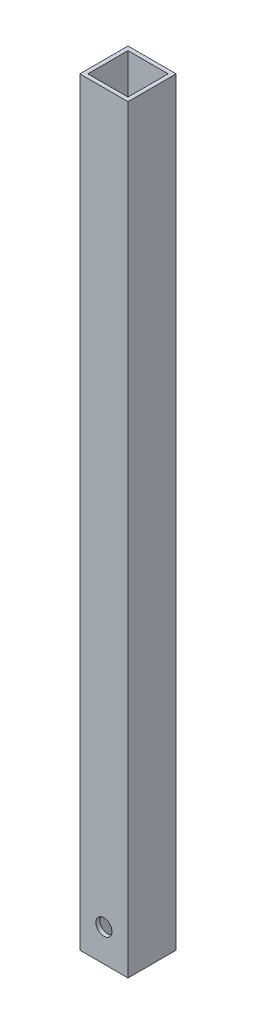
ISO-10303-21;
HEADER;
FILE_DESCRIPTION(('STEP AP214'),'2;1');
FILE_NAME('part.step','',(''),(''),'','','');
FILE_SCHEMA(('AUTOMOTIVE_DESIGN { 1 0 10303 214 1 1 1 1 }'));
ENDSEC;
DATA;
#1=APPLICATION_CONTEXT('core data for automotive mechanical design processes');
#2=APPLICATION_PROTOCOL_DEFINITION('international standard','automotive_design',2000,#1);
#3=PRODUCT_CONTEXT('',#1,'mechanical');
#4=PRODUCT('Part','Part','',(#3));
#5=PRODUCT_RELATED_PRODUCT_CATEGORY('part','',(#4));
#6=PRODUCT_DEFINITION_FORMATION('','',#4);
#7=PRODUCT_DEFINITION_CONTEXT('part definition',#1,'design');
#8=PRODUCT_DEFINITION('design','',#6,#7);
#9=PRODUCT_DEFINITION_SHAPE('','',#8);
#10=(LENGTH_UNIT() NAMED_UNIT(*) SI_UNIT(.MILLI.,.METRE.));
#11=(NAMED_UNIT(*) PLANE_ANGLE_UNIT() SI_UNIT($,.RADIAN.));
#12=(NAMED_UNIT(*) SI_UNIT($,.STERADIAN.) SOLID_ANGLE_UNIT());
#13=UNCERTAINTY_MEASURE_WITH_UNIT(LENGTH_MEASURE(1.E-05),#10,'distance_accuracy_value','');
#14=(GEOMETRIC_REPRESENTATION_CONTEXT(3) GLOBAL_UNCERTAINTY_ASSIGNED_CONTEXT((#13)) GLOBAL_UNIT_ASSIGNED_CONTEXT((#10,
#11,#12)) REPRESENTATION_CONTEXT('',''));
#15=CARTESIAN_POINT('',(0.,0.,0.));
#16=DIRECTION('',(0.,0.,1.));
#17=DIRECTION('',(1.,0.,0.));
#18=AXIS2_PLACEMENT_3D('',#15,#16,#17);
#19=CARTESIAN_POINT('',(0.,300.,0.));
#20=DIRECTION('',(0.,-1.,0.));
#21=DIRECTION('',(0.,0.,-1.));
#22=AXIS2_PLACEMENT_3D('',#19,#20,#21);
#23=PLANE('',#22);
#24=DIRECTION('',(0.,0.,-1.));
#25=VECTOR('',#24,1.);
#26=CARTESIAN_POINT('',(9.525,300.,9.525));
#27=LINE('',#26,#25);
#28=CARTESIAN_POINT('',(9.525,300.,9.525));
#29=VERTEX_POINT('',#28);
#30=CARTESIAN_POINT('',(9.525,300.,-9.525));
#31=VERTEX_POINT('',#30);
#32=EDGE_CURVE('E137',#29,#31,#27,.T.);
#33=ORIENTED_EDGE('',*,*,#32,.T.);
#34=DIRECTION('',(-1.,0.,0.));
#35=VECTOR('',#34,1.);
#36=CARTESIAN_POINT('',(-9.525,300.,-9.525));
#37=LINE('',#36,#35);
#38=CARTESIAN_POINT('',(-9.525,300.,-9.525));
#39=VERTEX_POINT('',#38);
#40=EDGE_CURVE('E140',#31,#39,#37,.T.);
#41=ORIENTED_EDGE('',*,*,#40,.T.);
#42=DIRECTION('',(0.,0.,1.));
#43=VECTOR('',#42,1.);
#44=CARTESIAN_POINT('',(-9.525,300.,9.525));
#45=LINE('',#44,#43);
#46=CARTESIAN_POINT('',(-9.525,300.,9.525));
#47=VERTEX_POINT('',#46);
#48=EDGE_CURVE('E143',#39,#47,#45,.T.);
#49=ORIENTED_EDGE('',*,*,#48,.T.);
#50=DIRECTION('',(1.,0.,0.));
#51=VECTOR('',#50,1.);
#52=CARTESIAN_POINT('',(-9.525,300.,9.525));
#53=LINE('',#52,#51);
#54=EDGE_CURVE('E145',#47,#29,#53,.T.);
#55=ORIENTED_EDGE('',*,*,#54,.T.);
#56=EDGE_LOOP('',(#33,#41,#49,#55));
#57=FACE_BOUND('',#56,.T.);
#58=DIRECTION('',(0.,0.,-1.));
#59=VECTOR('',#58,1.);
#60=CARTESIAN_POINT('',(7.93750000000001,300.,7.93749999999995));
#61=LINE('',#60,#59);
#62=CARTESIAN_POINT('',(7.93750000000001,300.,7.93749999999995));
#63=VERTEX_POINT('',#62);
#64=CARTESIAN_POINT('',(7.9375,300.,-7.93749999999999));
#65=VERTEX_POINT('',#64);
#66=EDGE_CURVE('E99',#63,#65,#61,.T.);
#67=ORIENTED_EDGE('',*,*,#66,.F.);
#68=DIRECTION('',(1.,0.,0.));
#69=VECTOR('',#68,1.);
#70=CARTESIAN_POINT('',(-7.93749999999997,300.,7.93749999999995));
#71=LINE('',#70,#69);
#72=CARTESIAN_POINT('',(-7.93749999999997,300.,7.93749999999995));
#73=VERTEX_POINT('',#72);
#74=EDGE_CURVE('E121',#73,#63,#71,.T.);
#75=ORIENTED_EDGE('',*,*,#74,.F.);
#76=DIRECTION('',(0.,0.,1.));
#77=VECTOR('',#76,1.);
#78=CARTESIAN_POINT('',(-7.93749999999997,300.,7.93749999999995));
#79=LINE('',#78,#77);
#80=CARTESIAN_POINT('',(-7.93749999999997,300.,-7.93749999999999));
#81=VERTEX_POINT('',#80);
#82=EDGE_CURVE('E119',#81,#73,#79,.T.);
#83=ORIENTED_EDGE('',*,*,#82,.F.);
#84=DIRECTION('',(-1.,0.,0.));
#85=VECTOR('',#84,1.);
#86=CARTESIAN_POINT('',(-7.93749999999997,300.,-7.93749999999999));
#87=LINE('',#86,#85);
#88=EDGE_CURVE('E107',#65,#81,#87,.T.);
#89=ORIENTED_EDGE('',*,*,#88,.F.);
#90=EDGE_LOOP('',(#67,#75,#83,#89));
#91=FACE_BOUND('',#90,.T.);
#92=ADVANCED_FACE('F33',(#57,#91),#23,.F.);
#93=CARTESIAN_POINT('',(0.,0.,0.));
#94=DIRECTION('',(0.,-1.,0.));
#95=DIRECTION('',(0.,0.,-1.));
#96=AXIS2_PLACEMENT_3D('',#93,#94,#95);
#97=PLANE('',#96);
#98=DIRECTION('',(0.,0.,-1.));
#99=VECTOR('',#98,1.);
#100=CARTESIAN_POINT('',(9.525,0.,9.525));
#101=LINE('',#100,#99);
#102=CARTESIAN_POINT('',(9.525,0.,9.525));
#103=VERTEX_POINT('',#102);
#104=CARTESIAN_POINT('',(9.525,0.,-9.525));
#105=VERTEX_POINT('',#104);
#106=EDGE_CURVE('E115',#103,#105,#101,.T.);
#107=ORIENTED_EDGE('',*,*,#106,.F.);
#108=DIRECTION('',(1.,0.,0.));
#109=VECTOR('',#108,1.);
#110=CARTESIAN_POINT('',(-9.525,0.,9.525));
#111=LINE('',#110,#109);
#112=CARTESIAN_POINT('',(-9.525,0.,9.525));
#113=VERTEX_POINT('',#112);
#114=EDGE_CURVE('E141',#113,#103,#111,.T.);
#115=ORIENTED_EDGE('',*,*,#114,.F.);
#116=DIRECTION('',(0.,0.,1.));
#117=VECTOR('',#116,1.);
#118=CARTESIAN_POINT('',(-9.525,0.,9.525));
#119=LINE('',#118,#117);
#120=CARTESIAN_POINT('',(-9.525,0.,-9.525));
#121=VERTEX_POINT('',#120);
#122=EDGE_CURVE('E152',#121,#113,#119,.T.);
#123=ORIENTED_EDGE('',*,*,#122,.F.);
#124=DIRECTION('',(-1.,0.,0.));
#125=VECTOR('',#124,1.);
#126=CARTESIAN_POINT('',(-9.525,0.,-9.525));
#127=LINE('',#126,#125);
#128=EDGE_CURVE('E150',#105,#121,#127,.T.);
#129=ORIENTED_EDGE('',*,*,#128,.F.);
#130=EDGE_LOOP('',(#107,#115,#123,#129));
#131=FACE_BOUND('',#130,.T.);
#132=DIRECTION('',(1.,0.,0.));
#133=VECTOR('',#132,1.);
#134=CARTESIAN_POINT('',(-7.93749999999997,0.,7.93749999999995));
#135=LINE('',#134,#133);
#136=CARTESIAN_POINT('',(-7.93749999999997,0.,7.93749999999995));
#137=VERTEX_POINT('',#136);
#138=CARTESIAN_POINT('',(7.93750000000001,0.,7.93749999999995));
#139=VERTEX_POINT('',#138);
#140=EDGE_CURVE('E108',#137,#139,#135,.T.);
#141=ORIENTED_EDGE('',*,*,#140,.T.);
#142=DIRECTION('',(0.,0.,-1.));
#143=VECTOR('',#142,1.);
#144=CARTESIAN_POINT('',(7.93750000000001,0.,7.93749999999995));
#145=LINE('',#144,#143);
#146=CARTESIAN_POINT('',(7.9375,0.,-7.93749999999999));
#147=VERTEX_POINT('',#146);
#148=EDGE_CURVE('E57',#139,#147,#145,.T.);
#149=ORIENTED_EDGE('',*,*,#148,.T.);
#150=DIRECTION('',(-1.,0.,0.));
#151=VECTOR('',#150,1.);
#152=CARTESIAN_POINT('',(-7.93749999999997,0.,-7.93749999999999));
#153=LINE('',#152,#151);
#154=CARTESIAN_POINT('',(-7.93749999999997,0.,-7.93749999999999));
#155=VERTEX_POINT('',#154);
#156=EDGE_CURVE('E114',#147,#155,#153,.T.);
#157=ORIENTED_EDGE('',*,*,#156,.T.);
#158=DIRECTION('',(0.,0.,1.));
#159=VECTOR('',#158,1.);
#160=CARTESIAN_POINT('',(-7.93749999999997,0.,7.93749999999995));
#161=LINE('',#160,#159);
#162=EDGE_CURVE('E129',#155,#137,#161,.T.);
#163=ORIENTED_EDGE('',*,*,#162,.T.);
#164=EDGE_LOOP('',(#141,#149,#157,#163));
#165=FACE_BOUND('',#164,.T.);
#166=ADVANCED_FACE('F171',(#131,#165),#97,.T.);
#167=CARTESIAN_POINT('',(9.525,300.,9.525));
#168=DIRECTION('',(-1.,0.,0.));
#169=DIRECTION('',(0.,0.,1.));
#170=AXIS2_PLACEMENT_3D('',#167,#168,#169);
#171=PLANE('',#170);
#172=ORIENTED_EDGE('',*,*,#106,.T.);
#173=DIRECTION('',(0.,-1.,0.));
#174=VECTOR('',#173,1.);
#175=CARTESIAN_POINT('',(9.525,300.,-9.525));
#176=LINE('',#175,#174);
#177=EDGE_CURVE('E11',#31,#105,#176,.T.);
#178=ORIENTED_EDGE('',*,*,#177,.F.);
#179=ORIENTED_EDGE('',*,*,#32,.F.);
#180=DIRECTION('',(0.,-1.,0.));
#181=VECTOR('',#180,1.);
#182=CARTESIAN_POINT('',(9.525,300.,9.525));
#183=LINE('',#182,#181);
#184=EDGE_CURVE('E147',#29,#103,#183,.T.);
#185=ORIENTED_EDGE('',*,*,#184,.T.);
#186=EDGE_LOOP('',(#172,#178,#179,#185));
#187=FACE_BOUND('',#186,.T.);
#188=ADVANCED_FACE('F35',(#187),#171,.F.);
#189=CARTESIAN_POINT('',(-9.525,300.,-9.525));
#190=DIRECTION('',(0.,0.,1.));
#191=DIRECTION('',(1.,0.,0.));
#192=AXIS2_PLACEMENT_3D('',#189,#190,#191);
#193=PLANE('',#192);
#194=CARTESIAN_POINT('',(0.,12.7,-9.525));
#195=DIRECTION('',(0.,0.,1.));
#196=DIRECTION('',(1.,0.,0.));
#197=AXIS2_PLACEMENT_3D('',#194,#195,#196);
#198=CIRCLE('',#197,3.175);
#199=CARTESIAN_POINT('',(3.175,12.7,-9.525));
#200=VERTEX_POINT('',#199);
#201=EDGE_CURVE('E208',#200,#200,#198,.T.);
#202=ORIENTED_EDGE('',*,*,#201,.T.);
#203=EDGE_LOOP('',(#202));
#204=FACE_BOUND('',#203,.T.);
#205=ORIENTED_EDGE('',*,*,#128,.T.);
#206=DIRECTION('',(0.,-1.,0.));
#207=VECTOR('',#206,1.);
#208=CARTESIAN_POINT('',(-9.525,300.,-9.525));
#209=LINE('',#208,#207);
#210=EDGE_CURVE('E42',#39,#121,#209,.T.);
#211=ORIENTED_EDGE('',*,*,#210,.F.);
#212=ORIENTED_EDGE('',*,*,#40,.F.);
#213=ORIENTED_EDGE('',*,*,#177,.T.);
#214=EDGE_LOOP('',(#205,#211,#212,#213));
#215=FACE_BOUND('',#214,.T.);
#216=ADVANCED_FACE('F181',(#204,#215),#193,.F.);
#217=CARTESIAN_POINT('',(-9.525,300.,9.525));
#218=DIRECTION('',(1.,0.,0.));
#219=DIRECTION('',(0.,0.,-1.));
#220=AXIS2_PLACEMENT_3D('',#217,#218,#219);
#221=PLANE('',#220);
#222=ORIENTED_EDGE('',*,*,#122,.T.);
#223=DIRECTION('',(0.,-1.,0.));
#224=VECTOR('',#223,1.);
#225=CARTESIAN_POINT('',(-9.525,300.,9.525));
#226=LINE('',#225,#224);
#227=EDGE_CURVE('E157',#47,#113,#226,.T.);
#228=ORIENTED_EDGE('',*,*,#227,.F.);
#229=ORIENTED_EDGE('',*,*,#48,.F.);
#230=ORIENTED_EDGE('',*,*,#210,.T.);
#231=EDGE_LOOP('',(#222,#228,#229,#230));
#232=FACE_BOUND('',#231,.T.);
#233=ADVANCED_FACE('F165',(#232),#221,.F.);
#234=CARTESIAN_POINT('',(-9.525,300.,9.525));
#235=DIRECTION('',(0.,0.,-1.));
#236=DIRECTION('',(-1.,0.,0.));
#237=AXIS2_PLACEMENT_3D('',#234,#235,#236);
#238=PLANE('',#237);
#239=CARTESIAN_POINT('',(0.,12.7,9.525));
#240=DIRECTION('',(0.,0.,1.));
#241=DIRECTION('',(1.,0.,0.));
#242=AXIS2_PLACEMENT_3D('',#239,#240,#241);
#243=CIRCLE('',#242,3.175);
#244=CARTESIAN_POINT('',(3.175,12.7,9.525));
#245=VERTEX_POINT('',#244);
#246=EDGE_CURVE('E206',#245,#245,#243,.T.);
#247=ORIENTED_EDGE('',*,*,#246,.F.);
#248=EDGE_LOOP('',(#247));
#249=FACE_BOUND('',#248,.T.);
#250=ORIENTED_EDGE('',*,*,#114,.T.);
#251=ORIENTED_EDGE('',*,*,#184,.F.);
#252=ORIENTED_EDGE('',*,*,#54,.F.);
#253=ORIENTED_EDGE('',*,*,#227,.T.);
#254=EDGE_LOOP('',(#250,#251,#252,#253));
#255=FACE_BOUND('',#254,.T.);
#256=ADVANCED_FACE('F175',(#249,#255),#238,.F.);
#257=CARTESIAN_POINT('',(7.93750000000001,300.,7.93749999999995));
#258=DIRECTION('',(-1.,0.,0.));
#259=DIRECTION('',(0.,0.,1.));
#260=AXIS2_PLACEMENT_3D('',#257,#258,#259);
#261=PLANE('',#260);
#262=ORIENTED_EDGE('',*,*,#148,.F.);
#263=DIRECTION('',(0.,-1.,0.));
#264=VECTOR('',#263,1.);
#265=CARTESIAN_POINT('',(7.93750000000001,300.,7.93749999999995));
#266=LINE('',#265,#264);
#267=EDGE_CURVE('E103',#63,#139,#266,.T.);
#268=ORIENTED_EDGE('',*,*,#267,.F.);
#269=ORIENTED_EDGE('',*,*,#66,.T.);
#270=DIRECTION('',(0.,-1.,0.));
#271=VECTOR('',#270,1.);
#272=CARTESIAN_POINT('',(7.9375,300.,-7.93749999999999));
#273=LINE('',#272,#271);
#274=EDGE_CURVE('E102',#65,#147,#273,.T.);
#275=ORIENTED_EDGE('',*,*,#274,.T.);
#276=EDGE_LOOP('',(#262,#268,#269,#275));
#277=FACE_BOUND('',#276,.T.);
#278=ADVANCED_FACE('F101',(#277),#261,.T.);
#279=CARTESIAN_POINT('',(-7.93749999999997,300.,-7.93749999999999));
#280=DIRECTION('',(0.,0.,1.));
#281=DIRECTION('',(1.,0.,0.));
#282=AXIS2_PLACEMENT_3D('',#279,#280,#281);
#283=PLANE('',#282);
#284=CARTESIAN_POINT('',(0.,12.7,-7.93749999999999));
#285=DIRECTION('',(0.,0.,1.));
#286=DIRECTION('',(1.,0.,0.));
#287=AXIS2_PLACEMENT_3D('',#284,#285,#286);
#288=CIRCLE('',#287,3.175);
#289=CARTESIAN_POINT('',(3.175,12.7,-7.93749999999999));
#290=VERTEX_POINT('',#289);
#291=EDGE_CURVE('E127',#290,#290,#288,.T.);
#292=ORIENTED_EDGE('',*,*,#291,.F.);
#293=EDGE_LOOP('',(#292));
#294=FACE_BOUND('',#293,.T.);
#295=ORIENTED_EDGE('',*,*,#156,.F.);
#296=ORIENTED_EDGE('',*,*,#274,.F.);
#297=ORIENTED_EDGE('',*,*,#88,.T.);
#298=DIRECTION('',(0.,-1.,0.));
#299=VECTOR('',#298,1.);
#300=CARTESIAN_POINT('',(-7.93749999999997,300.,-7.93749999999999));
#301=LINE('',#300,#299);
#302=EDGE_CURVE('E116',#81,#155,#301,.T.);
#303=ORIENTED_EDGE('',*,*,#302,.T.);
#304=EDGE_LOOP('',(#295,#296,#297,#303));
#305=FACE_BOUND('',#304,.T.);
#306=ADVANCED_FACE('F111',(#294,#305),#283,.T.);
#307=CARTESIAN_POINT('',(-7.93749999999997,300.,7.93749999999995));
#308=DIRECTION('',(1.,0.,0.));
#309=DIRECTION('',(0.,0.,-1.));
#310=AXIS2_PLACEMENT_3D('',#307,#308,#309);
#311=PLANE('',#310);
#312=ORIENTED_EDGE('',*,*,#162,.F.);
#313=ORIENTED_EDGE('',*,*,#302,.F.);
#314=ORIENTED_EDGE('',*,*,#82,.T.);
#315=DIRECTION('',(0.,-1.,0.));
#316=VECTOR('',#315,1.);
#317=CARTESIAN_POINT('',(-7.93749999999997,300.,7.93749999999995));
#318=LINE('',#317,#316);
#319=EDGE_CURVE('E49',#73,#137,#318,.T.);
#320=ORIENTED_EDGE('',*,*,#319,.T.);
#321=EDGE_LOOP('',(#312,#313,#314,#320));
#322=FACE_BOUND('',#321,.T.);
#323=ADVANCED_FACE('F221',(#322),#311,.T.);
#324=CARTESIAN_POINT('',(-7.93749999999997,300.,7.93749999999995));
#325=DIRECTION('',(0.,0.,-1.));
#326=DIRECTION('',(-1.,0.,0.));
#327=AXIS2_PLACEMENT_3D('',#324,#325,#326);
#328=PLANE('',#327);
#329=CARTESIAN_POINT('',(0.,12.7,7.93749999999995));
#330=DIRECTION('',(0.,0.,-1.));
#331=DIRECTION('',(-1.,0.,0.));
#332=AXIS2_PLACEMENT_3D('',#329,#330,#331);
#333=CIRCLE('',#332,3.175);
#334=CARTESIAN_POINT('',(-3.175,12.7,7.93749999999995));
#335=VERTEX_POINT('',#334);
#336=EDGE_CURVE('E37',#335,#335,#333,.T.);
#337=ORIENTED_EDGE('',*,*,#336,.F.);
#338=EDGE_LOOP('',(#337));
#339=FACE_BOUND('',#338,.T.);
#340=ORIENTED_EDGE('',*,*,#140,.F.);
#341=ORIENTED_EDGE('',*,*,#319,.F.);
#342=ORIENTED_EDGE('',*,*,#74,.T.);
#343=ORIENTED_EDGE('',*,*,#267,.T.);
#344=EDGE_LOOP('',(#340,#341,#342,#343));
#345=FACE_BOUND('',#344,.T.);
#346=ADVANCED_FACE('F219',(#339,#345),#328,.T.);
#347=CARTESIAN_POINT('',(0.,12.7,-9.525));
#348=DIRECTION('',(0.,0.,1.));
#349=DIRECTION('',(1.,0.,0.));
#350=AXIS2_PLACEMENT_3D('',#347,#348,#349);
#351=CYLINDRICAL_SURFACE('',#350,3.175);
#352=ORIENTED_EDGE('',*,*,#336,.T.);
#353=EDGE_LOOP('',(#352));
#354=FACE_BOUND('',#353,.T.);
#355=ORIENTED_EDGE('',*,*,#246,.T.);
#356=EDGE_LOOP('',(#355));
#357=FACE_BOUND('',#356,.T.);
#358=ADVANCED_FACE('F217',(#354,#357),#351,.F.);
#359=ORIENTED_EDGE('',*,*,#291,.T.);
#360=EDGE_LOOP('',(#359));
#361=FACE_BOUND('',#360,.T.);
#362=ORIENTED_EDGE('',*,*,#201,.F.);
#363=EDGE_LOOP('',(#362));
#364=FACE_BOUND('',#363,.T.);
#365=ADVANCED_FACE('F233',(#361,#364),#351,.F.);
#366=CLOSED_SHELL('',(#92,#166,#188,#216,#233,#256,#278,#306,#323,#346,#358,#365));
#367=MANIFOLD_SOLID_BREP('B2',#366);
#368=ADVANCED_BREP_SHAPE_REPRESENTATION('',(#18,#367),#14);
#369=SHAPE_DEFINITION_REPRESENTATION(#9,#368);
ENDSEC;
END-ISO-10303-21;
